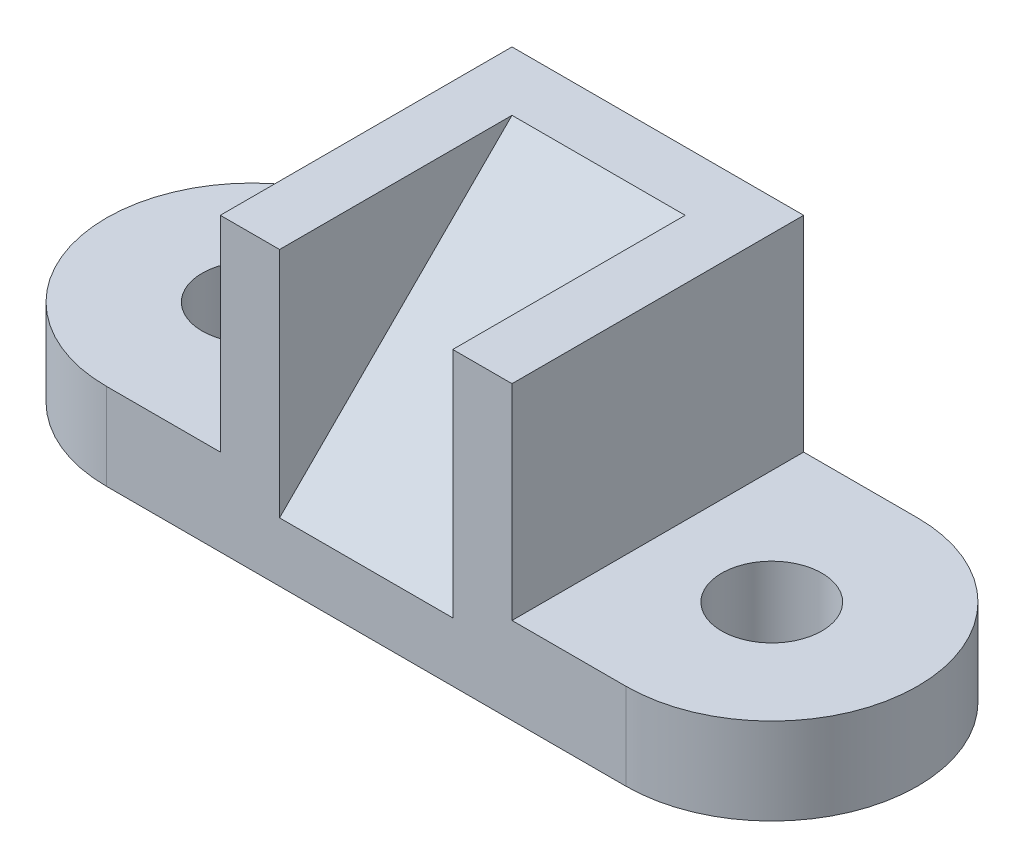
ISO-10303-21;
HEADER;
FILE_DESCRIPTION(('STEP AP214'),'2;1');
FILE_NAME('part.step','',(''),(''),'','','');
FILE_SCHEMA(('AUTOMOTIVE_DESIGN { 1 0 10303 214 1 1 1 1 }'));
ENDSEC;
DATA;
#1=APPLICATION_CONTEXT('core data for automotive mechanical design processes');
#2=APPLICATION_PROTOCOL_DEFINITION('international standard','automotive_design',2000,#1);
#3=PRODUCT_CONTEXT('',#1,'mechanical');
#4=PRODUCT('Part','Part','',(#3));
#5=PRODUCT_RELATED_PRODUCT_CATEGORY('part','',(#4));
#6=PRODUCT_DEFINITION_FORMATION('','',#4);
#7=PRODUCT_DEFINITION_CONTEXT('part definition',#1,'design');
#8=PRODUCT_DEFINITION('design','',#6,#7);
#9=PRODUCT_DEFINITION_SHAPE('','',#8);
#10=(LENGTH_UNIT() NAMED_UNIT(*) SI_UNIT(.MILLI.,.METRE.));
#11=(NAMED_UNIT(*) PLANE_ANGLE_UNIT() SI_UNIT($,.RADIAN.));
#12=(NAMED_UNIT(*) SI_UNIT($,.STERADIAN.) SOLID_ANGLE_UNIT());
#13=UNCERTAINTY_MEASURE_WITH_UNIT(LENGTH_MEASURE(1.E-05),#10,'distance_accuracy_value','');
#14=(GEOMETRIC_REPRESENTATION_CONTEXT(3) GLOBAL_UNCERTAINTY_ASSIGNED_CONTEXT((#13)) GLOBAL_UNIT_ASSIGNED_CONTEXT((#10,
#11,#12)) REPRESENTATION_CONTEXT('',''));
#15=CARTESIAN_POINT('',(0.,0.,0.));
#16=DIRECTION('',(0.,0.,1.));
#17=DIRECTION('',(1.,0.,0.));
#18=AXIS2_PLACEMENT_3D('',#15,#16,#17);
#19=CARTESIAN_POINT('',(-57.,19.,0.));
#20=DIRECTION('',(0.,1.,0.));
#21=DIRECTION('',(0.,0.,1.));
#22=AXIS2_PLACEMENT_3D('',#19,#20,#21);
#23=PLANE('',#22);
#24=DIRECTION('',(0.,0.,1.));
#25=VECTOR('',#24,1.);
#26=CARTESIAN_POINT('',(-32.,19.,32.));
#27=LINE('',#26,#25);
#28=CARTESIAN_POINT('',(-32.,19.,-32.));
#29=VERTEX_POINT('',#28);
#30=CARTESIAN_POINT('',(-32.,19.,32.));
#31=VERTEX_POINT('',#30);
#32=EDGE_CURVE('E62',#29,#31,#27,.T.);
#33=ORIENTED_EDGE('',*,*,#32,.F.);
#34=DIRECTION('',(-1.,0.,0.));
#35=VECTOR('',#34,1.);
#36=CARTESIAN_POINT('',(-57.,19.,-32.));
#37=LINE('',#36,#35);
#38=CARTESIAN_POINT('',(-57.,19.,-32.));
#39=VERTEX_POINT('',#38);
#40=EDGE_CURVE('E196',#29,#39,#37,.T.);
#41=ORIENTED_EDGE('',*,*,#40,.T.);
#42=CARTESIAN_POINT('',(-57.,19.,0.));
#43=DIRECTION('',(0.,1.,0.));
#44=DIRECTION('',(0.,0.,1.));
#45=AXIS2_PLACEMENT_3D('',#42,#43,#44);
#46=CIRCLE('',#45,32.);
#47=CARTESIAN_POINT('',(-57.,19.,32.));
#48=VERTEX_POINT('',#47);
#49=EDGE_CURVE('E187',#39,#48,#46,.T.);
#50=ORIENTED_EDGE('',*,*,#49,.T.);
#51=DIRECTION('',(1.,0.,0.));
#52=VECTOR('',#51,1.);
#53=CARTESIAN_POINT('',(-57.,19.,32.));
#54=LINE('',#53,#52);
#55=EDGE_CURVE('E192',#48,#31,#54,.T.);
#56=ORIENTED_EDGE('',*,*,#55,.T.);
#57=EDGE_LOOP('',(#33,#41,#50,#56));
#58=FACE_BOUND('',#57,.T.);
#59=CARTESIAN_POINT('',(-57.,19.,0.));
#60=DIRECTION('',(0.,1.,0.));
#61=DIRECTION('',(0.,0.,1.));
#62=AXIS2_PLACEMENT_3D('',#59,#60,#61);
#63=CIRCLE('',#62,11.);
#64=CARTESIAN_POINT('',(-57.,19.,11.));
#65=VERTEX_POINT('',#64);
#66=EDGE_CURVE('E181',#65,#65,#63,.T.);
#67=ORIENTED_EDGE('',*,*,#66,.F.);
#68=EDGE_LOOP('',(#67));
#69=FACE_BOUND('',#68,.T.);
#70=ADVANCED_FACE('F39',(#58,#69),#23,.T.);
#71=DIRECTION('',(0.,0.,-1.));
#72=VECTOR('',#71,1.);
#73=CARTESIAN_POINT('',(32.,19.,32.));
#74=LINE('',#73,#72);
#75=CARTESIAN_POINT('',(32.,19.,32.));
#76=VERTEX_POINT('',#75);
#77=CARTESIAN_POINT('',(32.,19.,-32.));
#78=VERTEX_POINT('',#77);
#79=EDGE_CURVE('E152',#76,#78,#74,.T.);
#80=ORIENTED_EDGE('',*,*,#79,.F.);
#81=CARTESIAN_POINT('',(57.,19.,32.));
#82=VERTEX_POINT('',#81);
#83=EDGE_CURVE('E190',#76,#82,#54,.T.);
#84=ORIENTED_EDGE('',*,*,#83,.T.);
#85=CARTESIAN_POINT('',(57.,19.,0.));
#86=DIRECTION('',(0.,1.,0.));
#87=DIRECTION('',(0.,0.,1.));
#88=AXIS2_PLACEMENT_3D('',#85,#86,#87);
#89=CIRCLE('',#88,32.);
#90=CARTESIAN_POINT('',(57.,19.,-32.));
#91=VERTEX_POINT('',#90);
#92=EDGE_CURVE('E194',#82,#91,#89,.T.);
#93=ORIENTED_EDGE('',*,*,#92,.T.);
#94=EDGE_CURVE('E197',#91,#78,#37,.T.);
#95=ORIENTED_EDGE('',*,*,#94,.T.);
#96=EDGE_LOOP('',(#80,#84,#93,#95));
#97=FACE_BOUND('',#96,.T.);
#98=CARTESIAN_POINT('',(57.,19.,0.));
#99=DIRECTION('',(0.,1.,0.));
#100=DIRECTION('',(0.,0.,1.));
#101=AXIS2_PLACEMENT_3D('',#98,#99,#100);
#102=CIRCLE('',#101,11.);
#103=CARTESIAN_POINT('',(57.,19.,11.));
#104=VERTEX_POINT('',#103);
#105=EDGE_CURVE('E175',#104,#104,#102,.T.);
#106=ORIENTED_EDGE('',*,*,#105,.F.);
#107=EDGE_LOOP('',(#106));
#108=FACE_BOUND('',#107,.T.);
#109=ADVANCED_FACE('F245',(#97,#108),#23,.T.);
#110=CARTESIAN_POINT('',(-57.,0.,0.));
#111=DIRECTION('',(0.,1.,0.));
#112=DIRECTION('',(0.,0.,1.));
#113=AXIS2_PLACEMENT_3D('',#110,#111,#112);
#114=PLANE('',#113);
#115=CARTESIAN_POINT('',(-57.,0.,0.));
#116=DIRECTION('',(0.,1.,0.));
#117=DIRECTION('',(0.,0.,1.));
#118=AXIS2_PLACEMENT_3D('',#115,#116,#117);
#119=CIRCLE('',#118,32.);
#120=CARTESIAN_POINT('',(-57.,0.,-32.));
#121=VERTEX_POINT('',#120);
#122=CARTESIAN_POINT('',(-57.,0.,32.));
#123=VERTEX_POINT('',#122);
#124=EDGE_CURVE('E184',#121,#123,#119,.T.);
#125=ORIENTED_EDGE('',*,*,#124,.F.);
#126=DIRECTION('',(-1.,0.,0.));
#127=VECTOR('',#126,1.);
#128=CARTESIAN_POINT('',(-57.,0.,-32.));
#129=LINE('',#128,#127);
#130=CARTESIAN_POINT('',(57.,0.,-32.));
#131=VERTEX_POINT('',#130);
#132=EDGE_CURVE('E191',#131,#121,#129,.T.);
#133=ORIENTED_EDGE('',*,*,#132,.F.);
#134=CARTESIAN_POINT('',(57.,0.,0.));
#135=DIRECTION('',(0.,1.,0.));
#136=DIRECTION('',(0.,0.,1.));
#137=AXIS2_PLACEMENT_3D('',#134,#135,#136);
#138=CIRCLE('',#137,32.);
#139=CARTESIAN_POINT('',(57.,0.,32.));
#140=VERTEX_POINT('',#139);
#141=EDGE_CURVE('E204',#140,#131,#138,.T.);
#142=ORIENTED_EDGE('',*,*,#141,.F.);
#143=DIRECTION('',(1.,0.,0.));
#144=VECTOR('',#143,1.);
#145=CARTESIAN_POINT('',(-57.,0.,32.));
#146=LINE('',#145,#144);
#147=EDGE_CURVE('E202',#123,#140,#146,.T.);
#148=ORIENTED_EDGE('',*,*,#147,.F.);
#149=EDGE_LOOP('',(#125,#133,#142,#148));
#150=FACE_BOUND('',#149,.T.);
#151=CARTESIAN_POINT('',(-57.,0.,0.));
#152=DIRECTION('',(0.,1.,0.));
#153=DIRECTION('',(0.,0.,1.));
#154=AXIS2_PLACEMENT_3D('',#151,#152,#153);
#155=CIRCLE('',#154,11.);
#156=CARTESIAN_POINT('',(-57.,0.,11.));
#157=VERTEX_POINT('',#156);
#158=EDGE_CURVE('E178',#157,#157,#155,.T.);
#159=ORIENTED_EDGE('',*,*,#158,.T.);
#160=EDGE_LOOP('',(#159));
#161=FACE_BOUND('',#160,.T.);
#162=CARTESIAN_POINT('',(57.,0.,0.));
#163=DIRECTION('',(0.,1.,0.));
#164=DIRECTION('',(0.,0.,1.));
#165=AXIS2_PLACEMENT_3D('',#162,#163,#164);
#166=CIRCLE('',#165,11.);
#167=CARTESIAN_POINT('',(57.,0.,11.));
#168=VERTEX_POINT('',#167);
#169=EDGE_CURVE('E174',#168,#168,#166,.T.);
#170=ORIENTED_EDGE('',*,*,#169,.T.);
#171=EDGE_LOOP('',(#170));
#172=FACE_BOUND('',#171,.T.);
#173=ADVANCED_FACE('F223',(#150,#161,#172),#114,.F.);
#174=CARTESIAN_POINT('',(-57.,19.,0.));
#175=DIRECTION('',(0.,-1.,0.));
#176=DIRECTION('',(0.,0.,-1.));
#177=AXIS2_PLACEMENT_3D('',#174,#175,#176);
#178=CYLINDRICAL_SURFACE('',#177,32.);
#179=ORIENTED_EDGE('',*,*,#124,.T.);
#180=DIRECTION('',(0.,-1.,0.));
#181=VECTOR('',#180,1.);
#182=CARTESIAN_POINT('',(-57.,19.,32.));
#183=LINE('',#182,#181);
#184=EDGE_CURVE('E11',#48,#123,#183,.T.);
#185=ORIENTED_EDGE('',*,*,#184,.F.);
#186=ORIENTED_EDGE('',*,*,#49,.F.);
#187=DIRECTION('',(0.,-1.,0.));
#188=VECTOR('',#187,1.);
#189=CARTESIAN_POINT('',(-57.,19.,-32.));
#190=LINE('',#189,#188);
#191=EDGE_CURVE('E199',#39,#121,#190,.T.);
#192=ORIENTED_EDGE('',*,*,#191,.T.);
#193=EDGE_LOOP('',(#179,#185,#186,#192));
#194=FACE_BOUND('',#193,.T.);
#195=ADVANCED_FACE('F41',(#194),#178,.T.);
#196=CARTESIAN_POINT('',(-57.,19.,32.));
#197=DIRECTION('',(0.,0.,-1.));
#198=DIRECTION('',(-1.,0.,0.));
#199=AXIS2_PLACEMENT_3D('',#196,#197,#198);
#200=PLANE('',#199);
#201=DIRECTION('',(1.,0.,0.));
#202=VECTOR('',#201,1.);
#203=CARTESIAN_POINT('',(32.,64.,32.));
#204=LINE('',#203,#202);
#205=CARTESIAN_POINT('',(19.,64.,32.));
#206=VERTEX_POINT('',#205);
#207=CARTESIAN_POINT('',(32.,64.,32.));
#208=VERTEX_POINT('',#207);
#209=EDGE_CURVE('E151',#206,#208,#204,.T.);
#210=ORIENTED_EDGE('',*,*,#209,.F.);
#211=DIRECTION('',(0.,1.,0.));
#212=VECTOR('',#211,1.);
#213=CARTESIAN_POINT('',(19.,13.,32.));
#214=LINE('',#213,#212);
#215=CARTESIAN_POINT('',(19.,13.,32.));
#216=VERTEX_POINT('',#215);
#217=EDGE_CURVE('E131',#216,#206,#214,.T.);
#218=ORIENTED_EDGE('',*,*,#217,.F.);
#219=DIRECTION('',(-1.,0.,0.));
#220=VECTOR('',#219,1.);
#221=CARTESIAN_POINT('',(19.,13.,32.));
#222=LINE('',#221,#220);
#223=CARTESIAN_POINT('',(-19.,13.,32.));
#224=VERTEX_POINT('',#223);
#225=EDGE_CURVE('E128',#216,#224,#222,.T.);
#226=ORIENTED_EDGE('',*,*,#225,.T.);
#227=DIRECTION('',(0.,1.,0.));
#228=VECTOR('',#227,1.);
#229=CARTESIAN_POINT('',(-19.,13.,32.));
#230=LINE('',#229,#228);
#231=CARTESIAN_POINT('',(-19.,64.,32.));
#232=VERTEX_POINT('',#231);
#233=EDGE_CURVE('E138',#224,#232,#230,.T.);
#234=ORIENTED_EDGE('',*,*,#233,.T.);
#235=CARTESIAN_POINT('',(-32.,64.,32.));
#236=VERTEX_POINT('',#235);
#237=EDGE_CURVE('E153',#236,#232,#204,.T.);
#238=ORIENTED_EDGE('',*,*,#237,.F.);
#239=DIRECTION('',(0.,-1.,0.));
#240=VECTOR('',#239,1.);
#241=CARTESIAN_POINT('',(-32.,64.,32.));
#242=LINE('',#241,#240);
#243=EDGE_CURVE('E171',#236,#31,#242,.T.);
#244=ORIENTED_EDGE('',*,*,#243,.T.);
#245=ORIENTED_EDGE('',*,*,#55,.F.);
#246=ORIENTED_EDGE('',*,*,#184,.T.);
#247=ORIENTED_EDGE('',*,*,#147,.T.);
#248=DIRECTION('',(0.,-1.,0.));
#249=VECTOR('',#248,1.);
#250=CARTESIAN_POINT('',(57.,19.,32.));
#251=LINE('',#250,#249);
#252=EDGE_CURVE('E47',#82,#140,#251,.T.);
#253=ORIENTED_EDGE('',*,*,#252,.F.);
#254=ORIENTED_EDGE('',*,*,#83,.F.);
#255=DIRECTION('',(0.,-1.,0.));
#256=VECTOR('',#255,1.);
#257=CARTESIAN_POINT('',(32.,64.,32.));
#258=LINE('',#257,#256);
#259=EDGE_CURVE('E168',#208,#76,#258,.T.);
#260=ORIENTED_EDGE('',*,*,#259,.F.);
#261=EDGE_LOOP('',(#210,#218,#226,#234,#238,#244,#245,#246,#247,#253,#254,#260));
#262=FACE_BOUND('',#261,.T.);
#263=ADVANCED_FACE('F247',(#262),#200,.F.);
#264=CARTESIAN_POINT('',(57.,19.,0.));
#265=DIRECTION('',(0.,-1.,0.));
#266=DIRECTION('',(0.,0.,-1.));
#267=AXIS2_PLACEMENT_3D('',#264,#265,#266);
#268=CYLINDRICAL_SURFACE('',#267,32.);
#269=ORIENTED_EDGE('',*,*,#141,.T.);
#270=DIRECTION('',(0.,-1.,0.));
#271=VECTOR('',#270,1.);
#272=CARTESIAN_POINT('',(57.,19.,-32.));
#273=LINE('',#272,#271);
#274=EDGE_CURVE('E209',#91,#131,#273,.T.);
#275=ORIENTED_EDGE('',*,*,#274,.F.);
#276=ORIENTED_EDGE('',*,*,#92,.F.);
#277=ORIENTED_EDGE('',*,*,#252,.T.);
#278=EDGE_LOOP('',(#269,#275,#276,#277));
#279=FACE_BOUND('',#278,.T.);
#280=ADVANCED_FACE('F216',(#279),#268,.T.);
#281=CARTESIAN_POINT('',(-57.,19.,-32.));
#282=DIRECTION('',(0.,0.,1.));
#283=DIRECTION('',(1.,0.,0.));
#284=AXIS2_PLACEMENT_3D('',#281,#282,#283);
#285=PLANE('',#284);
#286=ORIENTED_EDGE('',*,*,#132,.T.);
#287=ORIENTED_EDGE('',*,*,#191,.F.);
#288=ORIENTED_EDGE('',*,*,#40,.F.);
#289=DIRECTION('',(0.,-1.,0.));
#290=VECTOR('',#289,1.);
#291=CARTESIAN_POINT('',(-32.,64.,-32.));
#292=LINE('',#291,#290);
#293=CARTESIAN_POINT('',(-32.,64.,-32.));
#294=VERTEX_POINT('',#293);
#295=EDGE_CURVE('E159',#294,#29,#292,.T.);
#296=ORIENTED_EDGE('',*,*,#295,.F.);
#297=DIRECTION('',(-1.,0.,0.));
#298=VECTOR('',#297,1.);
#299=CARTESIAN_POINT('',(32.,64.,-32.));
#300=LINE('',#299,#298);
#301=CARTESIAN_POINT('',(32.,64.,-32.));
#302=VERTEX_POINT('',#301);
#303=EDGE_CURVE('E157',#302,#294,#300,.T.);
#304=ORIENTED_EDGE('',*,*,#303,.F.);
#305=DIRECTION('',(0.,-1.,0.));
#306=VECTOR('',#305,1.);
#307=CARTESIAN_POINT('',(32.,64.,-32.));
#308=LINE('',#307,#306);
#309=EDGE_CURVE('E165',#302,#78,#308,.T.);
#310=ORIENTED_EDGE('',*,*,#309,.T.);
#311=ORIENTED_EDGE('',*,*,#94,.F.);
#312=ORIENTED_EDGE('',*,*,#274,.T.);
#313=EDGE_LOOP('',(#286,#287,#288,#296,#304,#310,#311,#312));
#314=FACE_BOUND('',#313,.T.);
#315=ADVANCED_FACE('F227',(#314),#285,.F.);
#316=CARTESIAN_POINT('',(-57.,19.,0.));
#317=DIRECTION('',(0.,-1.,0.));
#318=DIRECTION('',(0.,0.,-1.));
#319=AXIS2_PLACEMENT_3D('',#316,#317,#318);
#320=CYLINDRICAL_SURFACE('',#319,11.);
#321=ORIENTED_EDGE('',*,*,#66,.T.);
#322=EDGE_LOOP('',(#321));
#323=FACE_BOUND('',#322,.T.);
#324=ORIENTED_EDGE('',*,*,#158,.F.);
#325=EDGE_LOOP('',(#324));
#326=FACE_BOUND('',#325,.T.);
#327=ADVANCED_FACE('F267',(#323,#326),#320,.F.);
#328=CARTESIAN_POINT('',(57.,19.,0.));
#329=DIRECTION('',(0.,-1.,0.));
#330=DIRECTION('',(0.,0.,-1.));
#331=AXIS2_PLACEMENT_3D('',#328,#329,#330);
#332=CYLINDRICAL_SURFACE('',#331,11.);
#333=ORIENTED_EDGE('',*,*,#105,.T.);
#334=EDGE_LOOP('',(#333));
#335=FACE_BOUND('',#334,.T.);
#336=ORIENTED_EDGE('',*,*,#169,.F.);
#337=EDGE_LOOP('',(#336));
#338=FACE_BOUND('',#337,.T.);
#339=ADVANCED_FACE('F297',(#335,#338),#332,.F.);
#340=CARTESIAN_POINT('',(-32.,64.,32.));
#341=DIRECTION('',(1.,0.,0.));
#342=DIRECTION('',(0.,0.,-1.));
#343=AXIS2_PLACEMENT_3D('',#340,#341,#342);
#344=PLANE('',#343);
#345=ORIENTED_EDGE('',*,*,#32,.T.);
#346=ORIENTED_EDGE('',*,*,#243,.F.);
#347=DIRECTION('',(0.,0.,1.));
#348=VECTOR('',#347,1.);
#349=CARTESIAN_POINT('',(-32.,64.,32.));
#350=LINE('',#349,#348);
#351=EDGE_CURVE('E148',#294,#236,#350,.T.);
#352=ORIENTED_EDGE('',*,*,#351,.F.);
#353=ORIENTED_EDGE('',*,*,#295,.T.);
#354=EDGE_LOOP('',(#345,#346,#352,#353));
#355=FACE_BOUND('',#354,.T.);
#356=ADVANCED_FACE('F237',(#355),#344,.F.);
#357=CARTESIAN_POINT('',(32.,64.,32.));
#358=DIRECTION('',(-1.,0.,0.));
#359=DIRECTION('',(0.,0.,1.));
#360=AXIS2_PLACEMENT_3D('',#357,#358,#359);
#361=PLANE('',#360);
#362=ORIENTED_EDGE('',*,*,#79,.T.);
#363=ORIENTED_EDGE('',*,*,#309,.F.);
#364=DIRECTION('',(0.,0.,-1.));
#365=VECTOR('',#364,1.);
#366=CARTESIAN_POINT('',(32.,64.,32.));
#367=LINE('',#366,#365);
#368=EDGE_CURVE('E155',#208,#302,#367,.T.);
#369=ORIENTED_EDGE('',*,*,#368,.F.);
#370=ORIENTED_EDGE('',*,*,#259,.T.);
#371=EDGE_LOOP('',(#362,#363,#369,#370));
#372=FACE_BOUND('',#371,.T.);
#373=ADVANCED_FACE('F242',(#372),#361,.F.);
#374=CARTESIAN_POINT('',(0.,64.,0.));
#375=DIRECTION('',(0.,1.,0.));
#376=DIRECTION('',(0.,0.,1.));
#377=AXIS2_PLACEMENT_3D('',#374,#375,#376);
#378=PLANE('',#377);
#379=DIRECTION('',(0.,0.,-1.));
#380=VECTOR('',#379,1.);
#381=CARTESIAN_POINT('',(19.,64.,32.));
#382=LINE('',#381,#380);
#383=CARTESIAN_POINT('',(19.,64.,-19.));
#384=VERTEX_POINT('',#383);
#385=EDGE_CURVE('E132',#206,#384,#382,.T.);
#386=ORIENTED_EDGE('',*,*,#385,.F.);
#387=ORIENTED_EDGE('',*,*,#209,.T.);
#388=ORIENTED_EDGE('',*,*,#368,.T.);
#389=ORIENTED_EDGE('',*,*,#303,.T.);
#390=ORIENTED_EDGE('',*,*,#351,.T.);
#391=ORIENTED_EDGE('',*,*,#237,.T.);
#392=DIRECTION('',(0.,0.,-1.));
#393=VECTOR('',#392,1.);
#394=CARTESIAN_POINT('',(-19.,64.,32.));
#395=LINE('',#394,#393);
#396=CARTESIAN_POINT('',(-19.,64.,-19.));
#397=VERTEX_POINT('',#396);
#398=EDGE_CURVE('E142',#232,#397,#395,.T.);
#399=ORIENTED_EDGE('',*,*,#398,.T.);
#400=DIRECTION('',(-1.,0.,0.));
#401=VECTOR('',#400,1.);
#402=CARTESIAN_POINT('',(19.,64.,-19.));
#403=LINE('',#402,#401);
#404=EDGE_CURVE('E125',#384,#397,#403,.T.);
#405=ORIENTED_EDGE('',*,*,#404,.F.);
#406=EDGE_LOOP('',(#386,#387,#388,#389,#390,#391,#399,#405));
#407=FACE_BOUND('',#406,.T.);
#408=ADVANCED_FACE('F140',(#407),#378,.T.);
#409=CARTESIAN_POINT('',(19.,64.,-19.));
#410=DIRECTION('',(0.,-0.707106781186548,-0.707106781186547));
#411=DIRECTION('',(0.,0.707106781186547,-0.707106781186548));
#412=AXIS2_PLACEMENT_3D('',#409,#410,#411);
#413=PLANE('',#412);
#414=DIRECTION('',(0.,-0.707106781186547,0.707106781186548));
#415=VECTOR('',#414,1.);
#416=CARTESIAN_POINT('',(-19.,64.,-19.));
#417=LINE('',#416,#415);
#418=EDGE_CURVE('E54',#397,#224,#417,.T.);
#419=ORIENTED_EDGE('',*,*,#418,.T.);
#420=ORIENTED_EDGE('',*,*,#225,.F.);
#421=DIRECTION('',(0.,-0.707106781186547,0.707106781186548));
#422=VECTOR('',#421,1.);
#423=CARTESIAN_POINT('',(19.,64.,-19.));
#424=LINE('',#423,#422);
#425=EDGE_CURVE('E121',#384,#216,#424,.T.);
#426=ORIENTED_EDGE('',*,*,#425,.F.);
#427=ORIENTED_EDGE('',*,*,#404,.T.);
#428=EDGE_LOOP('',(#419,#420,#426,#427));
#429=FACE_BOUND('',#428,.T.);
#430=ADVANCED_FACE('F123',(#429),#413,.F.);
#431=CARTESIAN_POINT('',(19.,0.,0.));
#432=DIRECTION('',(1.,0.,0.));
#433=DIRECTION('',(0.,0.,-1.));
#434=AXIS2_PLACEMENT_3D('',#431,#432,#433);
#435=PLANE('',#434);
#436=ORIENTED_EDGE('',*,*,#385,.T.);
#437=ORIENTED_EDGE('',*,*,#425,.T.);
#438=ORIENTED_EDGE('',*,*,#217,.T.);
#439=EDGE_LOOP('',(#436,#437,#438));
#440=FACE_BOUND('',#439,.T.);
#441=ADVANCED_FACE('F135',(#440),#435,.F.);
#442=CARTESIAN_POINT('',(-19.,0.,0.));
#443=DIRECTION('',(1.,0.,0.));
#444=DIRECTION('',(0.,0.,-1.));
#445=AXIS2_PLACEMENT_3D('',#442,#443,#444);
#446=PLANE('',#445);
#447=ORIENTED_EDGE('',*,*,#398,.F.);
#448=ORIENTED_EDGE('',*,*,#233,.F.);
#449=ORIENTED_EDGE('',*,*,#418,.F.);
#450=EDGE_LOOP('',(#447,#448,#449));
#451=FACE_BOUND('',#450,.T.);
#452=ADVANCED_FACE('F251',(#451),#446,.T.);
#453=CLOSED_SHELL('',(#70,#109,#173,#195,#263,#280,#315,#327,#339,#356,#373,#408,#430,#441,#452));
#454=MANIFOLD_SOLID_BREP('B2',#453);
#455=ADVANCED_BREP_SHAPE_REPRESENTATION('',(#18,#454),#14);
#456=SHAPE_DEFINITION_REPRESENTATION(#9,#455);
ENDSEC;
END-ISO-10303-21;
